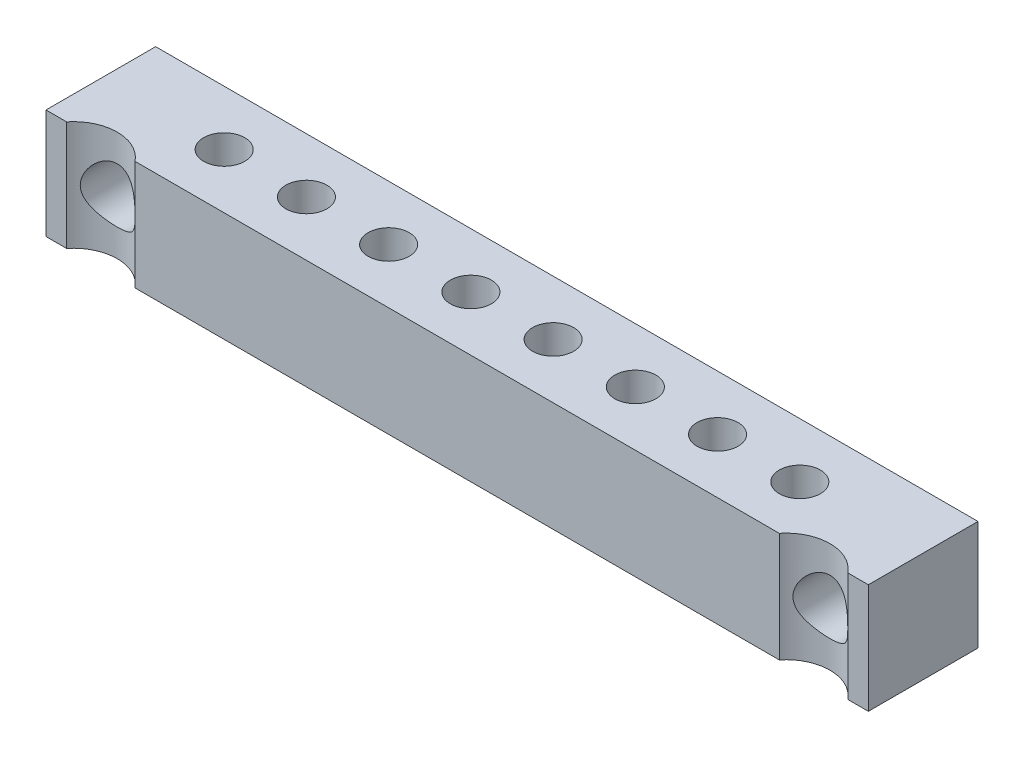
ISO-10303-21;
HEADER;
FILE_DESCRIPTION(('STEP AP214'),'2;1');
FILE_NAME('part.step','',(''),(''),'','','');
FILE_SCHEMA(('AUTOMOTIVE_DESIGN { 1 0 10303 214 1 1 1 1 }'));
ENDSEC;
DATA;
#1=APPLICATION_CONTEXT('core data for automotive mechanical design processes');
#2=APPLICATION_PROTOCOL_DEFINITION('international standard','automotive_design',2000,#1);
#3=PRODUCT_CONTEXT('',#1,'mechanical');
#4=PRODUCT('Part','Part','',(#3));
#5=PRODUCT_RELATED_PRODUCT_CATEGORY('part','',(#4));
#6=PRODUCT_DEFINITION_FORMATION('','',#4);
#7=PRODUCT_DEFINITION_CONTEXT('part definition',#1,'design');
#8=PRODUCT_DEFINITION('design','',#6,#7);
#9=PRODUCT_DEFINITION_SHAPE('','',#8);
#10=(LENGTH_UNIT() NAMED_UNIT(*) SI_UNIT(.MILLI.,.METRE.));
#11=(NAMED_UNIT(*) PLANE_ANGLE_UNIT() SI_UNIT($,.RADIAN.));
#12=(NAMED_UNIT(*) SI_UNIT($,.STERADIAN.) SOLID_ANGLE_UNIT());
#13=UNCERTAINTY_MEASURE_WITH_UNIT(LENGTH_MEASURE(1.E-05),#10,'distance_accuracy_value','');
#14=(GEOMETRIC_REPRESENTATION_CONTEXT(3) GLOBAL_UNCERTAINTY_ASSIGNED_CONTEXT((#13)) GLOBAL_UNIT_ASSIGNED_CONTEXT((#10,
#11,#12)) REPRESENTATION_CONTEXT('',''));
#15=CARTESIAN_POINT('',(0.,0.,0.));
#16=DIRECTION('',(0.,0.,1.));
#17=DIRECTION('',(1.,0.,0.));
#18=AXIS2_PLACEMENT_3D('',#15,#16,#17);
#19=CARTESIAN_POINT('',(0.,0.,4.));
#20=DIRECTION('',(0.,0.,-1.));
#21=DIRECTION('',(-1.,0.,0.));
#22=AXIS2_PLACEMENT_3D('',#19,#20,#21);
#23=PLANE('',#22);
#24=DIRECTION('',(-1.,0.,0.));
#25=VECTOR('',#24,1.);
#26=CARTESIAN_POINT('',(0.,4.,4.));
#27=LINE('',#26,#25);
#28=CARTESIAN_POINT('',(26.7510004003203,4.,4.));
#29=VERTEX_POINT('',#28);
#30=CARTESIAN_POINT('',(3.24899959967968,4.,4.));
#31=VERTEX_POINT('',#30);
#32=EDGE_CURVE('E117',#29,#31,#27,.T.);
#33=ORIENTED_EDGE('',*,*,#32,.T.);
#34=DIRECTION('',(0.,-1.,0.));
#35=VECTOR('',#34,1.);
#36=CARTESIAN_POINT('',(3.24899959967968,4.,4.));
#37=LINE('',#36,#35);
#38=CARTESIAN_POINT('',(3.24899959967968,0.,4.));
#39=VERTEX_POINT('',#38);
#40=EDGE_CURVE('E55',#31,#39,#37,.T.);
#41=ORIENTED_EDGE('',*,*,#40,.T.);
#42=DIRECTION('',(1.,0.,0.));
#43=VECTOR('',#42,1.);
#44=CARTESIAN_POINT('',(0.,0.,4.));
#45=LINE('',#44,#43);
#46=CARTESIAN_POINT('',(26.7510004003203,0.,4.));
#47=VERTEX_POINT('',#46);
#48=EDGE_CURVE('E119',#39,#47,#45,.T.);
#49=ORIENTED_EDGE('',*,*,#48,.T.);
#50=DIRECTION('',(0.,-1.,0.));
#51=VECTOR('',#50,1.);
#52=CARTESIAN_POINT('',(26.7510004003203,4.,4.));
#53=LINE('',#52,#51);
#54=EDGE_CURVE('E105',#47,#29,#53,.F.);
#55=ORIENTED_EDGE('',*,*,#54,.T.);
#56=EDGE_LOOP('',(#33,#41,#49,#55));
#57=FACE_BOUND('',#56,.T.);
#58=ADVANCED_FACE('F33',(#57),#23,.F.);
#59=CARTESIAN_POINT('',(30.,4.,4.));
#60=VERTEX_POINT('',#59);
#61=CARTESIAN_POINT('',(29.2489995996797,4.,4.));
#62=VERTEX_POINT('',#61);
#63=EDGE_CURVE('E125',#60,#62,#27,.T.);
#64=ORIENTED_EDGE('',*,*,#63,.T.);
#65=DIRECTION('',(0.,-1.,0.));
#66=VECTOR('',#65,1.);
#67=CARTESIAN_POINT('',(29.2489995996797,4.,4.));
#68=LINE('',#67,#66);
#69=CARTESIAN_POINT('',(29.2489995996797,0.,4.));
#70=VERTEX_POINT('',#69);
#71=EDGE_CURVE('E63',#62,#70,#68,.T.);
#72=ORIENTED_EDGE('',*,*,#71,.T.);
#73=CARTESIAN_POINT('',(30.,0.,4.));
#74=VERTEX_POINT('',#73);
#75=EDGE_CURVE('E221',#70,#74,#45,.T.);
#76=ORIENTED_EDGE('',*,*,#75,.T.);
#77=DIRECTION('',(0.,1.,0.));
#78=VECTOR('',#77,1.);
#79=CARTESIAN_POINT('',(30.,0.,4.));
#80=LINE('',#79,#78);
#81=EDGE_CURVE('E129',#74,#60,#80,.T.);
#82=ORIENTED_EDGE('',*,*,#81,.T.);
#83=EDGE_LOOP('',(#64,#72,#76,#82));
#84=FACE_BOUND('',#83,.T.);
#85=ADVANCED_FACE('F197',(#84),#23,.F.);
#86=CARTESIAN_POINT('',(0.,0.,4.));
#87=VERTEX_POINT('',#86);
#88=CARTESIAN_POINT('',(0.751000400320321,0.,4.));
#89=VERTEX_POINT('',#88);
#90=EDGE_CURVE('E215',#87,#89,#45,.T.);
#91=ORIENTED_EDGE('',*,*,#90,.T.);
#92=DIRECTION('',(0.,-1.,0.));
#93=VECTOR('',#92,1.);
#94=CARTESIAN_POINT('',(0.75100040032032,4.,4.));
#95=LINE('',#94,#93);
#96=CARTESIAN_POINT('',(0.751000400320321,4.,4.));
#97=VERTEX_POINT('',#96);
#98=EDGE_CURVE('E216',#89,#97,#95,.F.);
#99=ORIENTED_EDGE('',*,*,#98,.T.);
#100=CARTESIAN_POINT('',(0.,4.,4.));
#101=VERTEX_POINT('',#100);
#102=EDGE_CURVE('E126',#97,#101,#27,.T.);
#103=ORIENTED_EDGE('',*,*,#102,.T.);
#104=DIRECTION('',(0.,-1.,0.));
#105=VECTOR('',#104,1.);
#106=CARTESIAN_POINT('',(0.,0.,4.));
#107=LINE('',#106,#105);
#108=EDGE_CURVE('E143',#101,#87,#107,.T.);
#109=ORIENTED_EDGE('',*,*,#108,.T.);
#110=EDGE_LOOP('',(#91,#99,#103,#109));
#111=FACE_BOUND('',#110,.T.);
#112=ADVANCED_FACE('F199',(#111),#23,.F.);
#113=CARTESIAN_POINT('',(0.,0.,0.));
#114=DIRECTION('',(0.,0.,-1.));
#115=DIRECTION('',(-1.,0.,0.));
#116=AXIS2_PLACEMENT_3D('',#113,#114,#115);
#117=PLANE('',#116);
#118=CARTESIAN_POINT('',(2.,2.,0.));
#119=DIRECTION('',(0.,0.,1.));
#120=DIRECTION('',(1.,0.,0.));
#121=AXIS2_PLACEMENT_3D('',#118,#119,#120);
#122=CIRCLE('',#121,1.);
#123=CARTESIAN_POINT('',(3.,2.,0.));
#124=VERTEX_POINT('',#123);
#125=EDGE_CURVE('E137',#124,#124,#122,.T.);
#126=ORIENTED_EDGE('',*,*,#125,.T.);
#127=EDGE_LOOP('',(#126));
#128=FACE_BOUND('',#127,.T.);
#129=DIRECTION('',(0.,-1.,0.));
#130=VECTOR('',#129,1.);
#131=CARTESIAN_POINT('',(0.,0.,0.));
#132=LINE('',#131,#130);
#133=CARTESIAN_POINT('',(0.,4.,0.));
#134=VERTEX_POINT('',#133);
#135=CARTESIAN_POINT('',(0.,0.,0.));
#136=VERTEX_POINT('',#135);
#137=EDGE_CURVE('E133',#134,#136,#132,.T.);
#138=ORIENTED_EDGE('',*,*,#137,.F.);
#139=DIRECTION('',(-1.,0.,0.));
#140=VECTOR('',#139,1.);
#141=CARTESIAN_POINT('',(0.,4.,0.));
#142=LINE('',#141,#140);
#143=CARTESIAN_POINT('',(30.,4.,0.));
#144=VERTEX_POINT('',#143);
#145=EDGE_CURVE('E141',#144,#134,#142,.T.);
#146=ORIENTED_EDGE('',*,*,#145,.F.);
#147=DIRECTION('',(0.,1.,0.));
#148=VECTOR('',#147,1.);
#149=CARTESIAN_POINT('',(30.,0.,0.));
#150=LINE('',#149,#148);
#151=CARTESIAN_POINT('',(30.,0.,0.));
#152=VERTEX_POINT('',#151);
#153=EDGE_CURVE('E139',#152,#144,#150,.T.);
#154=ORIENTED_EDGE('',*,*,#153,.F.);
#155=DIRECTION('',(1.,0.,0.));
#156=VECTOR('',#155,1.);
#157=CARTESIAN_POINT('',(0.,0.,0.));
#158=LINE('',#157,#156);
#159=EDGE_CURVE('E136',#136,#152,#158,.T.);
#160=ORIENTED_EDGE('',*,*,#159,.F.);
#161=EDGE_LOOP('',(#138,#146,#154,#160));
#162=FACE_BOUND('',#161,.T.);
#163=CARTESIAN_POINT('',(28.,2.,0.));
#164=DIRECTION('',(0.,0.,1.));
#165=DIRECTION('',(-1.,0.,0.));
#166=AXIS2_PLACEMENT_3D('',#163,#164,#165);
#167=CIRCLE('',#166,1.);
#168=CARTESIAN_POINT('',(27.,2.,0.));
#169=VERTEX_POINT('',#168);
#170=EDGE_CURVE('E228',#169,#169,#167,.T.);
#171=ORIENTED_EDGE('',*,*,#170,.T.);
#172=EDGE_LOOP('',(#171));
#173=FACE_BOUND('',#172,.T.);
#174=ADVANCED_FACE('F206',(#128,#162,#173),#117,.T.);
#175=CARTESIAN_POINT('',(0.,0.,4.));
#176=DIRECTION('',(1.,0.,0.));
#177=DIRECTION('',(0.,0.,-1.));
#178=AXIS2_PLACEMENT_3D('',#175,#176,#177);
#179=PLANE('',#178);
#180=ORIENTED_EDGE('',*,*,#137,.T.);
#181=DIRECTION('',(0.,0.,-1.));
#182=VECTOR('',#181,1.);
#183=CARTESIAN_POINT('',(0.,0.,4.));
#184=LINE('',#183,#182);
#185=EDGE_CURVE('E11',#87,#136,#184,.T.);
#186=ORIENTED_EDGE('',*,*,#185,.F.);
#187=ORIENTED_EDGE('',*,*,#108,.F.);
#188=DIRECTION('',(0.,0.,-1.));
#189=VECTOR('',#188,1.);
#190=CARTESIAN_POINT('',(0.,4.,4.));
#191=LINE('',#190,#189);
#192=EDGE_CURVE('E128',#101,#134,#191,.T.);
#193=ORIENTED_EDGE('',*,*,#192,.T.);
#194=EDGE_LOOP('',(#180,#186,#187,#193));
#195=FACE_BOUND('',#194,.T.);
#196=ADVANCED_FACE('F35',(#195),#179,.F.);
#197=CARTESIAN_POINT('',(0.,0.,4.));
#198=DIRECTION('',(0.,1.,0.));
#199=DIRECTION('',(-1.,0.,0.));
#200=AXIS2_PLACEMENT_3D('',#197,#198,#199);
#201=PLANE('',#200);
#202=CARTESIAN_POINT('',(25.5,0.,1.99999999999996));
#203=DIRECTION('',(0.,-1.,0.));
#204=DIRECTION('',(0.,0.,1.));
#205=AXIS2_PLACEMENT_3D('',#202,#203,#204);
#206=CIRCLE('',#205,0.750000000000002);
#207=CARTESIAN_POINT('',(25.5,0.,2.74999999999996));
#208=VERTEX_POINT('',#207);
#209=EDGE_CURVE('E240',#208,#208,#206,.T.);
#210=ORIENTED_EDGE('',*,*,#209,.F.);
#211=EDGE_LOOP('',(#210));
#212=FACE_BOUND('',#211,.T.);
#213=CARTESIAN_POINT('',(16.5,0.,2.));
#214=DIRECTION('',(0.,-1.,0.));
#215=DIRECTION('',(0.,0.,1.));
#216=AXIS2_PLACEMENT_3D('',#213,#214,#215);
#217=CIRCLE('',#216,0.750000000000002);
#218=CARTESIAN_POINT('',(16.5,0.,2.75));
#219=VERTEX_POINT('',#218);
#220=EDGE_CURVE('E111',#219,#219,#217,.T.);
#221=ORIENTED_EDGE('',*,*,#220,.F.);
#222=EDGE_LOOP('',(#221));
#223=FACE_BOUND('',#222,.T.);
#224=CARTESIAN_POINT('',(19.5,0.,1.99999999999998));
#225=DIRECTION('',(0.,-1.,0.));
#226=DIRECTION('',(0.,0.,1.));
#227=AXIS2_PLACEMENT_3D('',#224,#225,#226);
#228=CIRCLE('',#227,0.750000000000002);
#229=CARTESIAN_POINT('',(19.5,0.,2.74999999999998));
#230=VERTEX_POINT('',#229);
#231=EDGE_CURVE('E278',#230,#230,#228,.T.);
#232=ORIENTED_EDGE('',*,*,#231,.F.);
#233=EDGE_LOOP('',(#232));
#234=FACE_BOUND('',#233,.T.);
#235=CARTESIAN_POINT('',(7.5,0.,1.99999999999996));
#236=DIRECTION('',(0.,-1.,0.));
#237=DIRECTION('',(0.,0.,-1.));
#238=AXIS2_PLACEMENT_3D('',#235,#236,#237);
#239=CIRCLE('',#238,0.75);
#240=CARTESIAN_POINT('',(7.5,0.,1.24999999999996));
#241=VERTEX_POINT('',#240);
#242=EDGE_CURVE('E241',#241,#241,#239,.T.);
#243=ORIENTED_EDGE('',*,*,#242,.F.);
#244=EDGE_LOOP('',(#243));
#245=FACE_BOUND('',#244,.T.);
#246=CARTESIAN_POINT('',(10.5,0.,1.99999999999998));
#247=DIRECTION('',(0.,-1.,0.));
#248=DIRECTION('',(0.,0.,-1.));
#249=AXIS2_PLACEMENT_3D('',#246,#247,#248);
#250=CIRCLE('',#249,0.75);
#251=CARTESIAN_POINT('',(10.5,0.,1.24999999999998));
#252=VERTEX_POINT('',#251);
#253=EDGE_CURVE('E248',#252,#252,#250,.T.);
#254=ORIENTED_EDGE('',*,*,#253,.F.);
#255=EDGE_LOOP('',(#254));
#256=FACE_BOUND('',#255,.T.);
#257=CARTESIAN_POINT('',(22.5,0.,1.99999999999996));
#258=DIRECTION('',(0.,-1.,0.));
#259=DIRECTION('',(0.,0.,1.));
#260=AXIS2_PLACEMENT_3D('',#257,#258,#259);
#261=CIRCLE('',#260,0.750000000000002);
#262=CARTESIAN_POINT('',(22.5,0.,2.74999999999996));
#263=VERTEX_POINT('',#262);
#264=EDGE_CURVE('E254',#263,#263,#261,.T.);
#265=ORIENTED_EDGE('',*,*,#264,.F.);
#266=EDGE_LOOP('',(#265));
#267=FACE_BOUND('',#266,.T.);
#268=CARTESIAN_POINT('',(13.5,0.,2.));
#269=DIRECTION('',(0.,-1.,0.));
#270=DIRECTION('',(0.,0.,-1.));
#271=AXIS2_PLACEMENT_3D('',#268,#269,#270);
#272=CIRCLE('',#271,0.75);
#273=CARTESIAN_POINT('',(13.5,0.,1.25));
#274=VERTEX_POINT('',#273);
#275=EDGE_CURVE('E260',#274,#274,#272,.T.);
#276=ORIENTED_EDGE('',*,*,#275,.F.);
#277=EDGE_LOOP('',(#276));
#278=FACE_BOUND('',#277,.T.);
#279=CARTESIAN_POINT('',(4.5,0.,1.99999999999994));
#280=DIRECTION('',(0.,-1.,0.));
#281=DIRECTION('',(0.,0.,-1.));
#282=AXIS2_PLACEMENT_3D('',#279,#280,#281);
#283=CIRCLE('',#282,0.75);
#284=CARTESIAN_POINT('',(4.5,0.,1.24999999999994));
#285=VERTEX_POINT('',#284);
#286=EDGE_CURVE('E234',#285,#285,#283,.T.);
#287=ORIENTED_EDGE('',*,*,#286,.F.);
#288=EDGE_LOOP('',(#287));
#289=FACE_BOUND('',#288,.T.);
#290=ORIENTED_EDGE('',*,*,#48,.F.);
#291=CARTESIAN_POINT('',(2.,0.,5.));
#292=DIRECTION('',(0.,-1.,0.));
#293=DIRECTION('',(0.,0.,-1.));
#294=AXIS2_PLACEMENT_3D('',#291,#292,#293);
#295=CIRCLE('',#294,1.6);
#296=EDGE_CURVE('E266',#89,#39,#295,.T.);
#297=ORIENTED_EDGE('',*,*,#296,.F.);
#298=ORIENTED_EDGE('',*,*,#90,.F.);
#299=ORIENTED_EDGE('',*,*,#185,.T.);
#300=ORIENTED_EDGE('',*,*,#159,.T.);
#301=DIRECTION('',(0.,0.,-1.));
#302=VECTOR('',#301,1.);
#303=CARTESIAN_POINT('',(30.,0.,4.));
#304=LINE('',#303,#302);
#305=EDGE_CURVE('E47',#74,#152,#304,.T.);
#306=ORIENTED_EDGE('',*,*,#305,.F.);
#307=ORIENTED_EDGE('',*,*,#75,.F.);
#308=CARTESIAN_POINT('',(28.,0.,5.));
#309=DIRECTION('',(0.,-1.,0.));
#310=DIRECTION('',(0.,0.,1.));
#311=AXIS2_PLACEMENT_3D('',#308,#309,#310);
#312=CIRCLE('',#311,1.6);
#313=EDGE_CURVE('E112',#47,#70,#312,.T.);
#314=ORIENTED_EDGE('',*,*,#313,.F.);
#315=EDGE_LOOP('',(#290,#297,#298,#299,#300,#306,#307,#314));
#316=FACE_BOUND('',#315,.T.);
#317=ADVANCED_FACE('F284',(#212,#223,#234,#245,#256,#267,#278,#289,#316),#201,.F.);
#318=CARTESIAN_POINT('',(30.,0.,4.));
#319=DIRECTION('',(-1.,0.,0.));
#320=DIRECTION('',(0.,0.,1.));
#321=AXIS2_PLACEMENT_3D('',#318,#319,#320);
#322=PLANE('',#321);
#323=ORIENTED_EDGE('',*,*,#153,.T.);
#324=DIRECTION('',(0.,0.,-1.));
#325=VECTOR('',#324,1.);
#326=CARTESIAN_POINT('',(30.,4.,4.));
#327=LINE('',#326,#325);
#328=EDGE_CURVE('E146',#60,#144,#327,.T.);
#329=ORIENTED_EDGE('',*,*,#328,.F.);
#330=ORIENTED_EDGE('',*,*,#81,.F.);
#331=ORIENTED_EDGE('',*,*,#305,.T.);
#332=EDGE_LOOP('',(#323,#329,#330,#331));
#333=FACE_BOUND('',#332,.T.);
#334=ADVANCED_FACE('F295',(#333),#322,.F.);
#335=CARTESIAN_POINT('',(0.,4.,4.));
#336=DIRECTION('',(0.,-1.,0.));
#337=DIRECTION('',(1.,0.,0.));
#338=AXIS2_PLACEMENT_3D('',#335,#336,#337);
#339=PLANE('',#338);
#340=CARTESIAN_POINT('',(25.5,4.,1.99999999999996));
#341=DIRECTION('',(0.,-1.,0.));
#342=DIRECTION('',(0.,0.,1.));
#343=AXIS2_PLACEMENT_3D('',#340,#341,#342);
#344=CIRCLE('',#343,0.750000000000002);
#345=CARTESIAN_POINT('',(25.5,4.,2.74999999999996));
#346=VERTEX_POINT('',#345);
#347=EDGE_CURVE('E269',#346,#346,#344,.T.);
#348=ORIENTED_EDGE('',*,*,#347,.T.);
#349=EDGE_LOOP('',(#348));
#350=FACE_BOUND('',#349,.T.);
#351=CARTESIAN_POINT('',(16.5,4.,2.));
#352=DIRECTION('',(0.,-1.,0.));
#353=DIRECTION('',(0.,0.,1.));
#354=AXIS2_PLACEMENT_3D('',#351,#352,#353);
#355=CIRCLE('',#354,0.750000000000002);
#356=CARTESIAN_POINT('',(16.5,4.,2.75));
#357=VERTEX_POINT('',#356);
#358=EDGE_CURVE('E275',#357,#357,#355,.T.);
#359=ORIENTED_EDGE('',*,*,#358,.T.);
#360=EDGE_LOOP('',(#359));
#361=FACE_BOUND('',#360,.T.);
#362=CARTESIAN_POINT('',(19.5,4.,1.99999999999998));
#363=DIRECTION('',(0.,-1.,0.));
#364=DIRECTION('',(0.,0.,1.));
#365=AXIS2_PLACEMENT_3D('',#362,#363,#364);
#366=CIRCLE('',#365,0.750000000000002);
#367=CARTESIAN_POINT('',(19.5,4.,2.74999999999998));
#368=VERTEX_POINT('',#367);
#369=EDGE_CURVE('E245',#368,#368,#366,.T.);
#370=ORIENTED_EDGE('',*,*,#369,.T.);
#371=EDGE_LOOP('',(#370));
#372=FACE_BOUND('',#371,.T.);
#373=CARTESIAN_POINT('',(7.5,4.,1.99999999999996));
#374=DIRECTION('',(0.,-1.,0.));
#375=DIRECTION('',(0.,0.,-1.));
#376=AXIS2_PLACEMENT_3D('',#373,#374,#375);
#377=CIRCLE('',#376,0.75);
#378=CARTESIAN_POINT('',(7.5,4.,1.24999999999996));
#379=VERTEX_POINT('',#378);
#380=EDGE_CURVE('E244',#379,#379,#377,.T.);
#381=ORIENTED_EDGE('',*,*,#380,.T.);
#382=EDGE_LOOP('',(#381));
#383=FACE_BOUND('',#382,.T.);
#384=CARTESIAN_POINT('',(10.5,4.,1.99999999999998));
#385=DIRECTION('',(0.,-1.,0.));
#386=DIRECTION('',(0.,0.,-1.));
#387=AXIS2_PLACEMENT_3D('',#384,#385,#386);
#388=CIRCLE('',#387,0.75);
#389=CARTESIAN_POINT('',(10.5,4.,1.24999999999998));
#390=VERTEX_POINT('',#389);
#391=EDGE_CURVE('E251',#390,#390,#388,.T.);
#392=ORIENTED_EDGE('',*,*,#391,.T.);
#393=EDGE_LOOP('',(#392));
#394=FACE_BOUND('',#393,.T.);
#395=CARTESIAN_POINT('',(22.5,4.,1.99999999999996));
#396=DIRECTION('',(0.,-1.,0.));
#397=DIRECTION('',(0.,0.,1.));
#398=AXIS2_PLACEMENT_3D('',#395,#396,#397);
#399=CIRCLE('',#398,0.750000000000002);
#400=CARTESIAN_POINT('',(22.5,4.,2.74999999999996));
#401=VERTEX_POINT('',#400);
#402=EDGE_CURVE('E257',#401,#401,#399,.T.);
#403=ORIENTED_EDGE('',*,*,#402,.T.);
#404=EDGE_LOOP('',(#403));
#405=FACE_BOUND('',#404,.T.);
#406=CARTESIAN_POINT('',(13.5,4.,2.));
#407=DIRECTION('',(0.,-1.,0.));
#408=DIRECTION('',(0.,0.,-1.));
#409=AXIS2_PLACEMENT_3D('',#406,#407,#408);
#410=CIRCLE('',#409,0.75);
#411=CARTESIAN_POINT('',(13.5,4.,1.25));
#412=VERTEX_POINT('',#411);
#413=EDGE_CURVE('E263',#412,#412,#410,.T.);
#414=ORIENTED_EDGE('',*,*,#413,.T.);
#415=EDGE_LOOP('',(#414));
#416=FACE_BOUND('',#415,.T.);
#417=CARTESIAN_POINT('',(4.5,4.,1.99999999999994));
#418=DIRECTION('',(0.,-1.,0.));
#419=DIRECTION('',(0.,0.,-1.));
#420=AXIS2_PLACEMENT_3D('',#417,#418,#419);
#421=CIRCLE('',#420,0.75);
#422=CARTESIAN_POINT('',(4.5,4.,1.24999999999994));
#423=VERTEX_POINT('',#422);
#424=EDGE_CURVE('E237',#423,#423,#421,.T.);
#425=ORIENTED_EDGE('',*,*,#424,.T.);
#426=EDGE_LOOP('',(#425));
#427=FACE_BOUND('',#426,.T.);
#428=ORIENTED_EDGE('',*,*,#102,.F.);
#429=CARTESIAN_POINT('',(2.,4.,5.));
#430=DIRECTION('',(0.,-1.,0.));
#431=DIRECTION('',(0.,0.,-1.));
#432=AXIS2_PLACEMENT_3D('',#429,#430,#431);
#433=CIRCLE('',#432,1.6);
#434=EDGE_CURVE('E124',#97,#31,#433,.T.);
#435=ORIENTED_EDGE('',*,*,#434,.T.);
#436=ORIENTED_EDGE('',*,*,#32,.F.);
#437=CARTESIAN_POINT('',(28.,4.,5.));
#438=DIRECTION('',(0.,-1.,0.));
#439=DIRECTION('',(0.,0.,1.));
#440=AXIS2_PLACEMENT_3D('',#437,#438,#439);
#441=CIRCLE('',#440,1.6);
#442=EDGE_CURVE('E102',#29,#62,#441,.T.);
#443=ORIENTED_EDGE('',*,*,#442,.T.);
#444=ORIENTED_EDGE('',*,*,#63,.F.);
#445=ORIENTED_EDGE('',*,*,#328,.T.);
#446=ORIENTED_EDGE('',*,*,#145,.T.);
#447=ORIENTED_EDGE('',*,*,#192,.F.);
#448=EDGE_LOOP('',(#428,#435,#436,#443,#444,#445,#446,#447));
#449=FACE_BOUND('',#448,.T.);
#450=ADVANCED_FACE('F123',(#350,#361,#372,#383,#394,#405,#416,#427,#449),#339,.F.);
#451=CARTESIAN_POINT('',(2.,2.,4.));
#452=DIRECTION('',(0.,0.,-1.));
#453=DIRECTION('',(-1.,0.,0.));
#454=AXIS2_PLACEMENT_3D('',#451,#452,#453);
#455=CYLINDRICAL_SURFACE('',#454,1.);
#456=CARTESIAN_POINT('',(1.,2.,3.75100040032032));
#457=CARTESIAN_POINT('',(1.00000430231612,2.04969622544234,3.75099359941953));
#458=CARTESIAN_POINT('',(1.00373844920268,2.0994702682962,3.74797885832931));
#459=CARTESIAN_POINT('',(1.01840839333653,2.1973410560635,3.73645026235618));
#460=CARTESIAN_POINT('',(1.02936375655559,2.24543286909219,3.72792146828708));
#461=CARTESIAN_POINT('',(1.05769540870503,2.33822585815907,3.70679931736767));
#462=CARTESIAN_POINT('',(1.07501605333772,2.38295248694545,3.69424130065574));
#463=CARTESIAN_POINT('',(1.11542443550461,2.46880708931052,3.66653639428454));
#464=CARTESIAN_POINT('',(1.13851233035127,2.5099349646852,3.65138943401059));
#465=CARTESIAN_POINT('',(1.19340849657309,2.59349212358158,3.61776310900231));
#466=CARTESIAN_POINT('',(1.225971125046,2.63535579266607,3.59910929418123));
#467=CARTESIAN_POINT('',(1.2973530684025,2.71350615931597,3.56197743316099));
#468=CARTESIAN_POINT('',(1.33617777496207,2.74978799782714,3.54349955309337));
#469=CARTESIAN_POINT('',(1.42465066779321,2.8200828681185,3.50616436887193));
#470=CARTESIAN_POINT('',(1.47503954487155,2.85329413448344,3.4875302220684));
#471=CARTESIAN_POINT('',(1.58207674333015,2.91050016381053,3.45453414640688));
#472=CARTESIAN_POINT('',(1.63871879481741,2.934504052601,3.4401679905613));
#473=CARTESIAN_POINT('',(1.75057849731039,2.96998584848565,3.4186412694544));
#474=CARTESIAN_POINT('',(1.80535549116221,2.98248913311755,3.41089662062369));
#475=CARTESIAN_POINT('',(1.91671591947019,2.99810565571472,3.40119564496639));
#476=CARTESIAN_POINT('',(1.97329739154878,3.00122876489644,3.39923323325075));
#477=CARTESIAN_POINT('',(2.07845266273707,2.99811544857791,3.40117672713978));
#478=CARTESIAN_POINT('',(2.12708201861903,2.99307889895928,3.40433040150478));
#479=CARTESIAN_POINT('',(2.22264531672294,2.97610641250934,3.4148378219102));
#480=CARTESIAN_POINT('',(2.26957913051758,2.96416995420999,3.42219188539906));
#481=CARTESIAN_POINT('',(2.36071129366166,2.93391697992231,3.4404949310826));
#482=CARTESIAN_POINT('',(2.40490230039459,2.91558414076113,3.4514531066087));
#483=CARTESIAN_POINT('',(2.48961537637551,2.87322499579201,3.47611493688535));
#484=CARTESIAN_POINT('',(2.530136606848,2.84919739288752,3.48981921700619));
#485=CARTESIAN_POINT('',(2.61177081245363,2.79277746773651,3.52085420199366));
#486=CARTESIAN_POINT('',(2.65232987593516,2.75971629860613,3.53842396554285));
#487=CARTESIAN_POINT('',(2.7276788767244,2.6878940958213,3.5744362979821));
#488=CARTESIAN_POINT('',(2.76246027103171,2.64912477884276,3.59288010840663));
#489=CARTESIAN_POINT('',(2.82988356714345,2.56103550167512,3.63142846310244));
#490=CARTESIAN_POINT('',(2.86165292383957,2.51099889531976,3.65143534773444));
#491=CARTESIAN_POINT('',(2.91620922562647,2.40508310418126,3.6878868872368));
#492=CARTESIAN_POINT('',(2.93901271682686,2.34921492483567,3.70433807846656));
#493=CARTESIAN_POINT('',(2.96974853482533,2.2481844776897,3.72726498746304));
#494=CARTESIAN_POINT('',(2.98001473377377,2.20407122988986,3.73522636555782));
#495=CARTESIAN_POINT('',(2.99448134830019,2.11430784900085,3.74656688899388));
#496=CARTESIAN_POINT('',(2.9986900508262,2.06865990316808,3.74995229410058));
#497=CARTESIAN_POINT('',(3.00078828763607,1.97701705556779,3.75163093175869));
#498=CARTESIAN_POINT('',(2.99866334061261,1.93102159890735,3.74991249487652));
#499=CARTESIAN_POINT('',(2.9882058684479,1.84017553517472,3.74163165709836));
#500=CARTESIAN_POINT('',(2.9798682025621,1.79532590802966,3.73506524476275));
#501=CARTESIAN_POINT('',(2.95763948579864,1.70862529290736,3.71815951518434));
#502=CARTESIAN_POINT('',(2.94384224501431,1.66673706133479,3.70788417650263));
#503=CARTESIAN_POINT('',(2.91121961550818,1.58577013235442,3.68467541247327));
#504=CARTESIAN_POINT('',(2.89239244217137,1.54669243838041,3.67174104408073));
#505=CARTESIAN_POINT('',(2.84612301417856,1.46455516865838,3.64170236808851));
#506=CARTESIAN_POINT('',(2.81772299051377,1.42215396700054,3.62427299409368));
#507=CARTESIAN_POINT('',(2.75495221057989,1.34225195804868,3.58884833599431));
#508=CARTESIAN_POINT('',(2.72057525959728,1.30475630641763,3.57085248077317));
#509=CARTESIAN_POINT('',(2.64030452759936,1.22961340300548,3.53293468784822));
#510=CARTESIAN_POINT('',(2.59344795977133,1.19290515439386,3.51316636169922));
#511=CARTESIAN_POINT('',(2.49303999029566,1.12794507849932,3.47692600828001));
#512=CARTESIAN_POINT('',(2.43949174299893,1.09968928802109,3.46045243736694));
#513=CARTESIAN_POINT('',(2.33034072050928,1.05440400703789,3.43352595233951));
#514=CARTESIAN_POINT('',(2.27505185803562,1.03680463482339,3.42277212328656));
#515=CARTESIAN_POINT('',(2.1614887991078,1.01141866505513,3.40714391929568));
#516=CARTESIAN_POINT('',(2.10321885059069,1.00361848819111,3.40226140853597));
#517=CARTESIAN_POINT('',(1.99472074240255,0.998762783968973,3.39922651401153));
#518=CARTESIAN_POINT('',(1.94457496192362,1.00029137857041,3.40018719501107));
#519=CARTESIAN_POINT('',(1.84537615112662,1.01076933997947,3.40671408032982));
#520=CARTESIAN_POINT('',(1.79632307132741,1.01971837006061,3.41228007566786));
#521=CARTESIAN_POINT('',(1.70236536425158,1.04412837990127,3.42723116248816));
#522=CARTESIAN_POINT('',(1.65737585545735,1.05935267189856,3.43647706022639));
#523=CARTESIAN_POINT('',(1.57062850471095,1.09564794253125,3.45804025058188));
#524=CARTESIAN_POINT('',(1.52887120950541,1.11671990758047,3.47035806134876));
#525=CARTESIAN_POINT('',(1.44507461002347,1.16652846319296,3.4985972620814));
#526=CARTESIAN_POINT('',(1.40345589827023,1.19583358505519,3.51475998026435));
#527=CARTESIAN_POINT('',(1.32542671331567,1.26006130426616,3.5485308763501));
#528=CARTESIAN_POINT('',(1.28902220555582,1.29499024019675,3.56614067415504));
#529=CARTESIAN_POINT('',(1.21702111895936,1.37529300984262,3.6039966792038));
#530=CARTESIAN_POINT('',(1.18229736100947,1.42144667614153,3.62425702842949));
#531=CARTESIAN_POINT('',(1.12098139995405,1.51971573280809,3.66260142802371));
#532=CARTESIAN_POINT('',(1.0943846995432,1.57182780392608,3.68068667866359));
#533=CARTESIAN_POINT('',(1.05520711261415,1.66912221434373,3.70856179135829));
#534=CARTESIAN_POINT('',(1.04083026978895,1.71330854470349,3.71930127720278));
#535=CARTESIAN_POINT('',(1.01829742255674,1.80397542236575,3.73648673249648));
#536=CARTESIAN_POINT('',(1.01012172603676,1.85044820401931,3.7429462847986));
#537=CARTESIAN_POINT('',(1.00352075053522,1.91442441909028,3.74818834888485));
#538=CARTESIAN_POINT('',(1.00220262992335,1.93149131641359,3.74923944362539));
#539=CARTESIAN_POINT('',(1.0004414021257,1.96570237321719,3.75064673043963));
#540=CARTESIAN_POINT('',(0.999998514986615,1.98284655104135,3.75100274776026));
#541=CARTESIAN_POINT('',(1.,2.,3.75100040032032));
#542=B_SPLINE_CURVE_WITH_KNOTS('',3,(#456,#457,#458,#459,#460,#461,#462,#463,#464,#465,#466,
#467,#468,#469,#470,#471,#472,#473,#474,#475,#476,#477,#478,#479,#480,#481,#482,#483,#484,#485,
#486,#487,#488,#489,#490,#491,#492,#493,#494,#495,#496,#497,#498,#499,#500,#501,#502,#503,#504,
#505,#506,#507,#508,#509,#510,#511,#512,#513,#514,#515,#516,#517,#518,#519,#520,#521,#522,#523,
#524,#525,#526,#527,#528,#529,#530,#531,#532,#533,#534,#535,#536,#537,#538,#539,#540,#541),
.UNSPECIFIED.,.T.,.F.,(4,2,2,2,2,2,2,2,2,2,2,2,2,2,2,2,2,2,2,2,2,2,2,2,2,2,2,2,2,2,2,2,2,2,2,2,
2,2,2,2,2,2,4),(0.,0.149009955209611,0.298425323517676,0.446564444904321,0.5947076075022,
0.762724965952059,0.930887767983289,1.11933788827565,1.30760074191408,1.47672330252318,
1.6456678247391,1.79193855666809,1.93822034461131,2.08487819860765,2.23156948902537,
2.39651603865686,2.56170435212948,2.74846454336657,2.93487844076222,3.07226220384214,
3.20945784005832,3.34696740192591,3.48459087328065,3.61994569874879,3.75534861189708,
3.91653066888103,4.07788078788203,4.26509278928711,4.452216872493,4.62816064395639,
4.80386033007169,4.95362881220099,5.10339049846866,5.24795655291539,5.39254700830304,
5.55214515286996,5.71192445567094,5.89473453936999,6.07744327668309,6.2199752181633,
6.36205262370708,6.41347287255598,6.46490604757618),.UNSPECIFIED.);
#543=CARTESIAN_POINT('',(1.,2.,3.75100040032032));
#544=VERTEX_POINT('',#543);
#545=EDGE_CURVE('E37',#544,#544,#542,.T.);
#546=ORIENTED_EDGE('',*,*,#545,.F.);
#547=EDGE_LOOP('',(#546));
#548=FACE_BOUND('',#547,.T.);
#549=ORIENTED_EDGE('',*,*,#125,.F.);
#550=EDGE_LOOP('',(#549));
#551=FACE_BOUND('',#550,.T.);
#552=ADVANCED_FACE('F302',(#548,#551),#455,.F.);
#553=CARTESIAN_POINT('',(28.,2.,4.));
#554=DIRECTION('',(0.,0.,-1.));
#555=DIRECTION('',(-1.,0.,0.));
#556=AXIS2_PLACEMENT_3D('',#553,#554,#555);
#557=CYLINDRICAL_SURFACE('',#556,1.);
#558=CARTESIAN_POINT('',(27.,2.,3.75100040032032));
#559=CARTESIAN_POINT('',(27.0000043023161,2.04969622544235,3.75099359941953));
#560=CARTESIAN_POINT('',(27.0037384492027,2.09947026829621,3.74797885832931));
#561=CARTESIAN_POINT('',(27.0184083933365,2.19734105606351,3.73645026235618));
#562=CARTESIAN_POINT('',(27.0293637565556,2.24543286909219,3.72792146828708));
#563=CARTESIAN_POINT('',(27.057695408705,2.33822585815908,3.70679931736767));
#564=CARTESIAN_POINT('',(27.0750160533377,2.38295248694545,3.69424130065574));
#565=CARTESIAN_POINT('',(27.1154244355046,2.46880708931053,3.66653639428454));
#566=CARTESIAN_POINT('',(27.1385123303513,2.50993496468521,3.6513894340106));
#567=CARTESIAN_POINT('',(27.1934084965731,2.59349212358159,3.61776310900231));
#568=CARTESIAN_POINT('',(27.225971125046,2.63535579266608,3.59910929418123));
#569=CARTESIAN_POINT('',(27.2973530684025,2.71350615931598,3.56197743316099));
#570=CARTESIAN_POINT('',(27.3361777749621,2.74978799782714,3.54349955309337));
#571=CARTESIAN_POINT('',(27.4246506677932,2.8200828681185,3.50616436887193));
#572=CARTESIAN_POINT('',(27.4750395448716,2.85329413448345,3.4875302220684));
#573=CARTESIAN_POINT('',(27.5820767433301,2.91050016381053,3.45453414640688));
#574=CARTESIAN_POINT('',(27.6387187948174,2.93450405260101,3.4401679905613));
#575=CARTESIAN_POINT('',(27.7505784973104,2.96998584848565,3.4186412694544));
#576=CARTESIAN_POINT('',(27.8053554911622,2.98248913311755,3.4108966206237));
#577=CARTESIAN_POINT('',(27.9167159194702,2.99810565571473,3.40119564496639));
#578=CARTESIAN_POINT('',(27.9732973915488,3.00122876489645,3.39923323325075));
#579=CARTESIAN_POINT('',(28.0784526627371,2.99811544857792,3.40117672713978));
#580=CARTESIAN_POINT('',(28.127082018619,2.99307889895928,3.40433040150478));
#581=CARTESIAN_POINT('',(28.2226453167229,2.97610641250935,3.4148378219102));
#582=CARTESIAN_POINT('',(28.2695791305176,2.96416995420999,3.42219188539906));
#583=CARTESIAN_POINT('',(28.3607112936617,2.93391697992231,3.4404949310826));
#584=CARTESIAN_POINT('',(28.4049023003946,2.91558414076113,3.45145310660871));
#585=CARTESIAN_POINT('',(28.4896153763755,2.87322499579201,3.47611493688536));
#586=CARTESIAN_POINT('',(28.530136606848,2.84919739288752,3.48981921700619));
#587=CARTESIAN_POINT('',(28.6117708124536,2.79277746773651,3.52085420199366));
#588=CARTESIAN_POINT('',(28.6523298759352,2.75971629860614,3.53842396554285));
#589=CARTESIAN_POINT('',(28.7276788767244,2.68789409582131,3.57443629798211));
#590=CARTESIAN_POINT('',(28.7624602710317,2.64912477884277,3.59288010840663));
#591=CARTESIAN_POINT('',(28.8298835671435,2.56103550167512,3.63142846310244));
#592=CARTESIAN_POINT('',(28.8616529238396,2.51099889531976,3.65143534773444));
#593=CARTESIAN_POINT('',(28.9162092256265,2.40508310418126,3.68788688723681));
#594=CARTESIAN_POINT('',(28.9390127168269,2.34921492483567,3.70433807846657));
#595=CARTESIAN_POINT('',(28.9697485348253,2.2481844776897,3.72726498746304));
#596=CARTESIAN_POINT('',(28.9800147337738,2.20407122988987,3.73522636555782));
#597=CARTESIAN_POINT('',(28.9944813483002,2.11430784900086,3.74656688899388));
#598=CARTESIAN_POINT('',(28.9986900508262,2.06865990316809,3.74995229410058));
#599=CARTESIAN_POINT('',(29.0007882876361,1.97701705556779,3.75163093175869));
#600=CARTESIAN_POINT('',(28.9986633406126,1.93102159890735,3.74991249487652));
#601=CARTESIAN_POINT('',(28.9882058684479,1.84017553517472,3.74163165709836));
#602=CARTESIAN_POINT('',(28.9798682025621,1.79532590802967,3.73506524476275));
#603=CARTESIAN_POINT('',(28.9576394857986,1.70862529290736,3.71815951518435));
#604=CARTESIAN_POINT('',(28.9438422450143,1.66673706133479,3.70788417650263));
#605=CARTESIAN_POINT('',(28.9112196155082,1.58577013235442,3.68467541247327));
#606=CARTESIAN_POINT('',(28.8923924421714,1.54669243838041,3.67174104408074));
#607=CARTESIAN_POINT('',(28.8461230141786,1.46455516865838,3.64170236808851));
#608=CARTESIAN_POINT('',(28.8177229905138,1.42215396700054,3.62427299409369));
#609=CARTESIAN_POINT('',(28.7549522105799,1.34225195804869,3.58884833599431));
#610=CARTESIAN_POINT('',(28.7205752595973,1.30475630641763,3.57085248077317));
#611=CARTESIAN_POINT('',(28.6403045275994,1.22961340300548,3.53293468784822));
#612=CARTESIAN_POINT('',(28.5934479597713,1.19290515439386,3.51316636169923));
#613=CARTESIAN_POINT('',(28.4930399902957,1.12794507849932,3.47692600828001));
#614=CARTESIAN_POINT('',(28.4394917429989,1.09968928802109,3.46045243736694));
#615=CARTESIAN_POINT('',(28.3303407205093,1.05440400703789,3.43352595233951));
#616=CARTESIAN_POINT('',(28.2750518580356,1.03680463482339,3.42277212328656));
#617=CARTESIAN_POINT('',(28.1614887991078,1.01141866505513,3.40714391929568));
#618=CARTESIAN_POINT('',(28.1032188505907,1.00361848819111,3.40226140853598));
#619=CARTESIAN_POINT('',(27.9947207424025,0.998762783968974,3.39922651401153));
#620=CARTESIAN_POINT('',(27.9445749619236,1.00029137857041,3.40018719501107));
#621=CARTESIAN_POINT('',(27.8453761511266,1.01076933997947,3.40671408032982));
#622=CARTESIAN_POINT('',(27.7963230713274,1.01971837006062,3.41228007566786));
#623=CARTESIAN_POINT('',(27.7023653642516,1.04412837990128,3.42723116248816));
#624=CARTESIAN_POINT('',(27.6573758554574,1.05935267189856,3.43647706022639));
#625=CARTESIAN_POINT('',(27.5706285047109,1.09564794253125,3.45804025058188));
#626=CARTESIAN_POINT('',(27.5288712095054,1.11671990758047,3.47035806134876));
#627=CARTESIAN_POINT('',(27.4450746100235,1.16652846319296,3.4985972620814));
#628=CARTESIAN_POINT('',(27.4034558982702,1.19583358505519,3.51475998026436));
#629=CARTESIAN_POINT('',(27.3254267133157,1.26006130426616,3.5485308763501));
#630=CARTESIAN_POINT('',(27.2890222055558,1.29499024019675,3.56614067415504));
#631=CARTESIAN_POINT('',(27.2170211189594,1.37529300984262,3.6039966792038));
#632=CARTESIAN_POINT('',(27.1822973610095,1.42144667614153,3.62425702842949));
#633=CARTESIAN_POINT('',(27.120981399954,1.5197157328081,3.66260142802371));
#634=CARTESIAN_POINT('',(27.0943846995432,1.57182780392608,3.68068667866359));
#635=CARTESIAN_POINT('',(27.0552071126141,1.66912221434374,3.70856179135829));
#636=CARTESIAN_POINT('',(27.0408302697889,1.71330854470349,3.71930127720278));
#637=CARTESIAN_POINT('',(27.0182974225567,1.80397542236576,3.73648673249649));
#638=CARTESIAN_POINT('',(27.0101217260368,1.85044820401932,3.7429462847986));
#639=CARTESIAN_POINT('',(27.0035207505352,1.91442441909028,3.74818834888485));
#640=CARTESIAN_POINT('',(27.0022026299233,1.93149131641359,3.74923944362539));
#641=CARTESIAN_POINT('',(27.0004414021257,1.96570237321719,3.75064673043963));
#642=CARTESIAN_POINT('',(26.9999985149866,1.98284655104135,3.75100274776026));
#643=CARTESIAN_POINT('',(27.,2.,3.75100040032032));
#644=B_SPLINE_CURVE_WITH_KNOTS('',3,(#558,#559,#560,#561,#562,#563,#564,#565,#566,#567,#568,
#569,#570,#571,#572,#573,#574,#575,#576,#577,#578,#579,#580,#581,#582,#583,#584,#585,#586,#587,
#588,#589,#590,#591,#592,#593,#594,#595,#596,#597,#598,#599,#600,#601,#602,#603,#604,#605,#606,
#607,#608,#609,#610,#611,#612,#613,#614,#615,#616,#617,#618,#619,#620,#621,#622,#623,#624,#625,
#626,#627,#628,#629,#630,#631,#632,#633,#634,#635,#636,#637,#638,#639,#640,#641,#642,#643),
.UNSPECIFIED.,.T.,.F.,(4,2,2,2,2,2,2,2,2,2,2,2,2,2,2,2,2,2,2,2,2,2,2,2,2,2,2,2,2,2,2,2,2,2,2,2,
2,2,2,2,2,2,4),(0.,0.149009955209612,0.298425323517677,0.446564444904322,0.5947076075022,
0.762724965952058,0.93088776798329,1.11933788827565,1.30760074191409,1.47672330252318,
1.6456678247391,1.79193855666809,1.93822034461132,2.08487819860766,2.23156948902538,
2.39651603865686,2.56170435212949,2.74846454336657,2.93487844076222,3.07226220384214,
3.20945784005832,3.34696740192591,3.48459087328065,3.61994569874879,3.75534861189709,
3.91653066888103,4.07788078788203,4.26509278928712,4.45221687249301,4.6281606439564,
4.80386033007169,4.953628812201,5.10339049846867,5.24795655291539,5.39254700830305,
5.55214515286997,5.71192445567094,5.89473453936999,6.0774432766831,6.21997521816331,
6.36205262370709,6.41347287255599,6.46490604757619),.UNSPECIFIED.);
#645=CARTESIAN_POINT('',(27.,2.,3.75100040032032));
#646=VERTEX_POINT('',#645);
#647=EDGE_CURVE('E120',#646,#646,#644,.T.);
#648=ORIENTED_EDGE('',*,*,#647,.F.);
#649=EDGE_LOOP('',(#648));
#650=FACE_BOUND('',#649,.T.);
#651=ORIENTED_EDGE('',*,*,#170,.F.);
#652=EDGE_LOOP('',(#651));
#653=FACE_BOUND('',#652,.T.);
#654=ADVANCED_FACE('F156',(#650,#653),#557,.F.);
#655=CARTESIAN_POINT('',(28.,4.,5.));
#656=DIRECTION('',(0.,-1.,0.));
#657=DIRECTION('',(0.,0.,-1.));
#658=AXIS2_PLACEMENT_3D('',#655,#656,#657);
#659=CYLINDRICAL_SURFACE('',#658,1.6);
#660=ORIENTED_EDGE('',*,*,#647,.T.);
#661=EDGE_LOOP('',(#660));
#662=FACE_BOUND('',#661,.T.);
#663=ORIENTED_EDGE('',*,*,#442,.F.);
#664=ORIENTED_EDGE('',*,*,#54,.F.);
#665=ORIENTED_EDGE('',*,*,#313,.T.);
#666=ORIENTED_EDGE('',*,*,#71,.F.);
#667=EDGE_LOOP('',(#663,#664,#665,#666));
#668=FACE_BOUND('',#667,.T.);
#669=ADVANCED_FACE('F104',(#662,#668),#659,.F.);
#670=CARTESIAN_POINT('',(2.,4.,5.));
#671=DIRECTION('',(0.,-1.,0.));
#672=DIRECTION('',(0.,0.,-1.));
#673=AXIS2_PLACEMENT_3D('',#670,#671,#672);
#674=CYLINDRICAL_SURFACE('',#673,1.6);
#675=ORIENTED_EDGE('',*,*,#545,.T.);
#676=EDGE_LOOP('',(#675));
#677=FACE_BOUND('',#676,.T.);
#678=ORIENTED_EDGE('',*,*,#434,.F.);
#679=ORIENTED_EDGE('',*,*,#98,.F.);
#680=ORIENTED_EDGE('',*,*,#296,.T.);
#681=ORIENTED_EDGE('',*,*,#40,.F.);
#682=EDGE_LOOP('',(#678,#679,#680,#681));
#683=FACE_BOUND('',#682,.T.);
#684=ADVANCED_FACE('F163',(#677,#683),#674,.F.);
#685=CARTESIAN_POINT('',(4.5,4.,1.99999999999994));
#686=DIRECTION('',(0.,-1.,0.));
#687=DIRECTION('',(0.,0.,-1.));
#688=AXIS2_PLACEMENT_3D('',#685,#686,#687);
#689=CYLINDRICAL_SURFACE('',#688,0.75);
#690=ORIENTED_EDGE('',*,*,#424,.F.);
#691=EDGE_LOOP('',(#690));
#692=FACE_BOUND('',#691,.T.);
#693=ORIENTED_EDGE('',*,*,#286,.T.);
#694=EDGE_LOOP('',(#693));
#695=FACE_BOUND('',#694,.T.);
#696=ADVANCED_FACE('F175',(#692,#695),#689,.F.);
#697=CARTESIAN_POINT('',(13.5,4.,2.));
#698=DIRECTION('',(0.,-1.,0.));
#699=DIRECTION('',(0.,0.,-1.));
#700=AXIS2_PLACEMENT_3D('',#697,#698,#699);
#701=CYLINDRICAL_SURFACE('',#700,0.75);
#702=ORIENTED_EDGE('',*,*,#413,.F.);
#703=EDGE_LOOP('',(#702));
#704=FACE_BOUND('',#703,.T.);
#705=ORIENTED_EDGE('',*,*,#275,.T.);
#706=EDGE_LOOP('',(#705));
#707=FACE_BOUND('',#706,.T.);
#708=ADVANCED_FACE('F171',(#704,#707),#701,.F.);
#709=CARTESIAN_POINT('',(22.5,4.,1.99999999999996));
#710=DIRECTION('',(0.,-1.,0.));
#711=DIRECTION('',(0.,0.,-1.));
#712=AXIS2_PLACEMENT_3D('',#709,#710,#711);
#713=CYLINDRICAL_SURFACE('',#712,0.750000000000002);
#714=ORIENTED_EDGE('',*,*,#402,.F.);
#715=EDGE_LOOP('',(#714));
#716=FACE_BOUND('',#715,.T.);
#717=ORIENTED_EDGE('',*,*,#264,.T.);
#718=EDGE_LOOP('',(#717));
#719=FACE_BOUND('',#718,.T.);
#720=ADVANCED_FACE('F174',(#716,#719),#713,.F.);
#721=CARTESIAN_POINT('',(10.5,4.,1.99999999999998));
#722=DIRECTION('',(0.,-1.,0.));
#723=DIRECTION('',(0.,0.,-1.));
#724=AXIS2_PLACEMENT_3D('',#721,#722,#723);
#725=CYLINDRICAL_SURFACE('',#724,0.75);
#726=ORIENTED_EDGE('',*,*,#391,.F.);
#727=EDGE_LOOP('',(#726));
#728=FACE_BOUND('',#727,.T.);
#729=ORIENTED_EDGE('',*,*,#253,.T.);
#730=EDGE_LOOP('',(#729));
#731=FACE_BOUND('',#730,.T.);
#732=ADVANCED_FACE('F179',(#728,#731),#725,.F.);
#733=CARTESIAN_POINT('',(7.5,4.,1.99999999999996));
#734=DIRECTION('',(0.,-1.,0.));
#735=DIRECTION('',(0.,0.,-1.));
#736=AXIS2_PLACEMENT_3D('',#733,#734,#735);
#737=CYLINDRICAL_SURFACE('',#736,0.75);
#738=ORIENTED_EDGE('',*,*,#380,.F.);
#739=EDGE_LOOP('',(#738));
#740=FACE_BOUND('',#739,.T.);
#741=ORIENTED_EDGE('',*,*,#242,.T.);
#742=EDGE_LOOP('',(#741));
#743=FACE_BOUND('',#742,.T.);
#744=ADVANCED_FACE('F183',(#740,#743),#737,.F.);
#745=CARTESIAN_POINT('',(19.5,4.,1.99999999999998));
#746=DIRECTION('',(0.,-1.,0.));
#747=DIRECTION('',(0.,0.,-1.));
#748=AXIS2_PLACEMENT_3D('',#745,#746,#747);
#749=CYLINDRICAL_SURFACE('',#748,0.750000000000002);
#750=ORIENTED_EDGE('',*,*,#369,.F.);
#751=EDGE_LOOP('',(#750));
#752=FACE_BOUND('',#751,.T.);
#753=ORIENTED_EDGE('',*,*,#231,.T.);
#754=EDGE_LOOP('',(#753));
#755=FACE_BOUND('',#754,.T.);
#756=ADVANCED_FACE('F186',(#752,#755),#749,.F.);
#757=CARTESIAN_POINT('',(16.5,4.,2.));
#758=DIRECTION('',(0.,-1.,0.));
#759=DIRECTION('',(0.,0.,-1.));
#760=AXIS2_PLACEMENT_3D('',#757,#758,#759);
#761=CYLINDRICAL_SURFACE('',#760,0.750000000000002);
#762=ORIENTED_EDGE('',*,*,#358,.F.);
#763=EDGE_LOOP('',(#762));
#764=FACE_BOUND('',#763,.T.);
#765=ORIENTED_EDGE('',*,*,#220,.T.);
#766=EDGE_LOOP('',(#765));
#767=FACE_BOUND('',#766,.T.);
#768=ADVANCED_FACE('F165',(#764,#767),#761,.F.);
#769=CARTESIAN_POINT('',(25.5,4.,1.99999999999996));
#770=DIRECTION('',(0.,-1.,0.));
#771=DIRECTION('',(0.,0.,-1.));
#772=AXIS2_PLACEMENT_3D('',#769,#770,#771);
#773=CYLINDRICAL_SURFACE('',#772,0.750000000000002);
#774=ORIENTED_EDGE('',*,*,#347,.F.);
#775=EDGE_LOOP('',(#774));
#776=FACE_BOUND('',#775,.T.);
#777=ORIENTED_EDGE('',*,*,#209,.T.);
#778=EDGE_LOOP('',(#777));
#779=FACE_BOUND('',#778,.T.);
#780=ADVANCED_FACE('F167',(#776,#779),#773,.F.);
#781=CLOSED_SHELL('',(#58,#85,#112,#174,#196,#317,#334,#450,#552,#654,#669,#684,#696,#708,#720,
#732,#744,#756,#768,#780));
#782=MANIFOLD_SOLID_BREP('B2',#781);
#783=ADVANCED_BREP_SHAPE_REPRESENTATION('',(#18,#782),#14);
#784=SHAPE_DEFINITION_REPRESENTATION(#9,#783);
ENDSEC;
END-ISO-10303-21;
